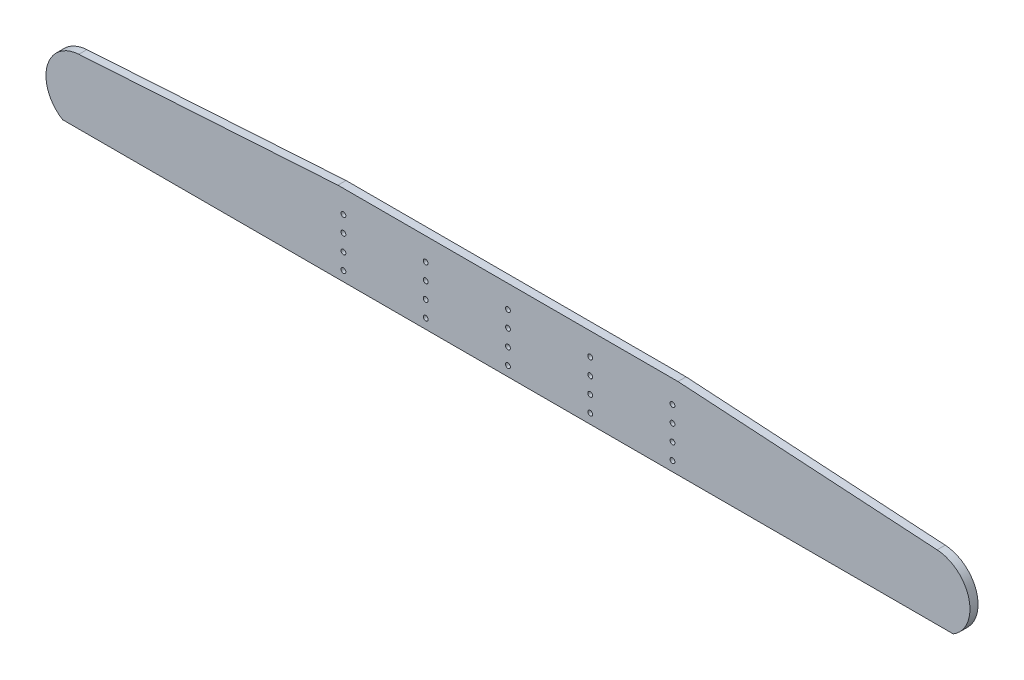
ISO-10303-21;
HEADER;
FILE_DESCRIPTION(('STEP AP214'),'2;1');
FILE_NAME('part.step','',(''),(''),'','','');
FILE_SCHEMA(('AUTOMOTIVE_DESIGN { 1 0 10303 214 1 1 1 1 }'));
ENDSEC;
DATA;
#1=APPLICATION_CONTEXT('core data for automotive mechanical design processes');
#2=APPLICATION_PROTOCOL_DEFINITION('international standard','automotive_design',2000,#1);
#3=PRODUCT_CONTEXT('',#1,'mechanical');
#4=PRODUCT('Part','Part','',(#3));
#5=PRODUCT_RELATED_PRODUCT_CATEGORY('part','',(#4));
#6=PRODUCT_DEFINITION_FORMATION('','',#4);
#7=PRODUCT_DEFINITION_CONTEXT('part definition',#1,'design');
#8=PRODUCT_DEFINITION('design','',#6,#7);
#9=PRODUCT_DEFINITION_SHAPE('','',#8);
#10=(LENGTH_UNIT() NAMED_UNIT(*) SI_UNIT(.MILLI.,.METRE.));
#11=(NAMED_UNIT(*) PLANE_ANGLE_UNIT() SI_UNIT($,.RADIAN.));
#12=(NAMED_UNIT(*) SI_UNIT($,.STERADIAN.) SOLID_ANGLE_UNIT());
#13=UNCERTAINTY_MEASURE_WITH_UNIT(LENGTH_MEASURE(1.E-05),#10,'distance_accuracy_value','');
#14=(GEOMETRIC_REPRESENTATION_CONTEXT(3) GLOBAL_UNCERTAINTY_ASSIGNED_CONTEXT((#13)) GLOBAL_UNIT_ASSIGNED_CONTEXT((#10,
#11,#12)) REPRESENTATION_CONTEXT('',''));
#15=CARTESIAN_POINT('',(0.,0.,0.));
#16=DIRECTION('',(0.,0.,1.));
#17=DIRECTION('',(1.,0.,0.));
#18=AXIS2_PLACEMENT_3D('',#15,#16,#17);
#19=CARTESIAN_POINT('',(0.,-25.,5.));
#20=DIRECTION('',(0.,-1.,0.));
#21=DIRECTION('',(0.,0.,-1.));
#22=AXIS2_PLACEMENT_3D('',#19,#20,#21);
#23=PLANE('',#22);
#24=DIRECTION('',(-1.,0.,0.));
#25=VECTOR('',#24,1.);
#26=CARTESIAN_POINT('',(0.,-25.,0.));
#27=LINE('',#26,#25);
#28=CARTESIAN_POINT('',(275.,-25.,0.));
#29=VERTEX_POINT('',#28);
#30=CARTESIAN_POINT('',(-275.,-25.,0.));
#31=VERTEX_POINT('',#30);
#32=EDGE_CURVE('E122',#29,#31,#27,.T.);
#33=ORIENTED_EDGE('',*,*,#32,.F.);
#34=DIRECTION('',(0.,0.,-1.));
#35=VECTOR('',#34,1.);
#36=CARTESIAN_POINT('',(275.,-25.,5.));
#37=LINE('',#36,#35);
#38=CARTESIAN_POINT('',(275.,-25.,5.));
#39=VERTEX_POINT('',#38);
#40=EDGE_CURVE('E12',#39,#29,#37,.T.);
#41=ORIENTED_EDGE('',*,*,#40,.F.);
#42=DIRECTION('',(-1.,0.,0.));
#43=VECTOR('',#42,1.);
#44=CARTESIAN_POINT('',(0.,-25.,5.));
#45=LINE('',#44,#43);
#46=CARTESIAN_POINT('',(-275.,-25.,5.));
#47=VERTEX_POINT('',#46);
#48=EDGE_CURVE('E136',#39,#47,#45,.T.);
#49=ORIENTED_EDGE('',*,*,#48,.T.);
#50=DIRECTION('',(0.,0.,-1.));
#51=VECTOR('',#50,1.);
#52=CARTESIAN_POINT('',(-275.,-25.,5.));
#53=LINE('',#52,#51);
#54=EDGE_CURVE('E84',#47,#31,#53,.T.);
#55=ORIENTED_EDGE('',*,*,#54,.T.);
#56=EDGE_LOOP('',(#33,#41,#49,#55));
#57=FACE_BOUND('',#56,.T.);
#58=ADVANCED_FACE('F40',(#57),#23,.T.);
#59=CARTESIAN_POINT('',(263.650793650794,-6.58730158730157,5.));
#60=DIRECTION('',(0.,0.,-1.));
#61=DIRECTION('',(-1.,0.,0.));
#62=AXIS2_PLACEMENT_3D('',#59,#60,#61);
#63=CYLINDRICAL_SURFACE('',#62,21.6294231914273);
#64=CARTESIAN_POINT('',(263.650793650794,-6.58730158730157,0.));
#65=DIRECTION('',(0.,0.,1.));
#66=DIRECTION('',(1.,0.,0.));
#67=AXIS2_PLACEMENT_3D('',#64,#65,#66);
#68=CIRCLE('',#67,21.6294231914273);
#69=CARTESIAN_POINT('',(265.,15.,0.));
#70=VERTEX_POINT('',#69);
#71=EDGE_CURVE('E125',#70,#29,#68,.F.);
#72=ORIENTED_EDGE('',*,*,#71,.F.);
#73=DIRECTION('',(0.,0.,-1.));
#74=VECTOR('',#73,1.);
#75=CARTESIAN_POINT('',(265.,15.,5.));
#76=LINE('',#75,#74);
#77=CARTESIAN_POINT('',(265.,15.,5.));
#78=VERTEX_POINT('',#77);
#79=EDGE_CURVE('E48',#78,#70,#76,.T.);
#80=ORIENTED_EDGE('',*,*,#79,.F.);
#81=CARTESIAN_POINT('',(263.650793650794,-6.58730158730157,5.));
#82=DIRECTION('',(0.,0.,1.));
#83=DIRECTION('',(1.,0.,0.));
#84=AXIS2_PLACEMENT_3D('',#81,#82,#83);
#85=CIRCLE('',#84,21.6294231914273);
#86=EDGE_CURVE('E117',#78,#39,#85,.F.);
#87=ORIENTED_EDGE('',*,*,#86,.T.);
#88=ORIENTED_EDGE('',*,*,#40,.T.);
#89=EDGE_LOOP('',(#72,#80,#87,#88));
#90=FACE_BOUND('',#89,.T.);
#91=ADVANCED_FACE('F145',(#90),#63,.T.);
#92=CARTESIAN_POINT('',(1.96498054474708,31.4396887159533,5.));
#93=DIRECTION('',(0.0623782861551805,0.998052578482888,0.));
#94=DIRECTION('',(-0.998052578482889,0.0623782861551805,0.));
#95=AXIS2_PLACEMENT_3D('',#92,#93,#94);
#96=PLANE('',#95);
#97=DIRECTION('',(0.998052578482889,-0.0623782861551805,0.));
#98=VECTOR('',#97,1.);
#99=CARTESIAN_POINT('',(1.96498054474708,31.4396887159533,0.));
#100=LINE('',#99,#98);
#101=CARTESIAN_POINT('',(105.,25.,0.));
#102=VERTEX_POINT('',#101);
#103=EDGE_CURVE('E129',#102,#70,#100,.T.);
#104=ORIENTED_EDGE('',*,*,#103,.F.);
#105=DIRECTION('',(0.,0.,-1.));
#106=VECTOR('',#105,1.);
#107=CARTESIAN_POINT('',(105.,25.,5.));
#108=LINE('',#107,#106);
#109=CARTESIAN_POINT('',(105.,25.,5.));
#110=VERTEX_POINT('',#109);
#111=EDGE_CURVE('E105',#110,#102,#108,.T.);
#112=ORIENTED_EDGE('',*,*,#111,.F.);
#113=DIRECTION('',(0.998052578482889,-0.0623782861551805,0.));
#114=VECTOR('',#113,1.);
#115=CARTESIAN_POINT('',(1.96498054474708,31.4396887159533,5.));
#116=LINE('',#115,#114);
#117=EDGE_CURVE('E115',#110,#78,#116,.T.);
#118=ORIENTED_EDGE('',*,*,#117,.T.);
#119=ORIENTED_EDGE('',*,*,#79,.T.);
#120=EDGE_LOOP('',(#104,#112,#118,#119));
#121=FACE_BOUND('',#120,.T.);
#122=ADVANCED_FACE('F142',(#121),#96,.T.);
#123=CARTESIAN_POINT('',(0.,25.,5.));
#124=DIRECTION('',(0.,1.,0.));
#125=DIRECTION('',(-1.,0.,0.));
#126=AXIS2_PLACEMENT_3D('',#123,#124,#125);
#127=PLANE('',#126);
#128=DIRECTION('',(1.,0.,0.));
#129=VECTOR('',#128,1.);
#130=CARTESIAN_POINT('',(0.,25.,0.));
#131=LINE('',#130,#129);
#132=CARTESIAN_POINT('',(-105.,25.,0.));
#133=VERTEX_POINT('',#132);
#134=EDGE_CURVE('E104',#133,#102,#131,.T.);
#135=ORIENTED_EDGE('',*,*,#134,.F.);
#136=DIRECTION('',(0.,0.,-1.));
#137=VECTOR('',#136,1.);
#138=CARTESIAN_POINT('',(-105.,25.,5.));
#139=LINE('',#138,#137);
#140=CARTESIAN_POINT('',(-105.,25.,5.));
#141=VERTEX_POINT('',#140);
#142=EDGE_CURVE('E98',#141,#133,#139,.T.);
#143=ORIENTED_EDGE('',*,*,#142,.F.);
#144=DIRECTION('',(1.,0.,0.));
#145=VECTOR('',#144,1.);
#146=CARTESIAN_POINT('',(0.,25.,5.));
#147=LINE('',#146,#145);
#148=EDGE_CURVE('E102',#141,#110,#147,.T.);
#149=ORIENTED_EDGE('',*,*,#148,.T.);
#150=ORIENTED_EDGE('',*,*,#111,.T.);
#151=EDGE_LOOP('',(#135,#143,#149,#150));
#152=FACE_BOUND('',#151,.T.);
#153=ADVANCED_FACE('F100',(#152),#127,.T.);
#154=CARTESIAN_POINT('',(-1.96498054474708,31.4396887159533,5.));
#155=DIRECTION('',(0.0623782861551805,-0.998052578482888,0.));
#156=DIRECTION('',(0.998052578482889,0.0623782861551805,0.));
#157=AXIS2_PLACEMENT_3D('',#154,#155,#156);
#158=PLANE('',#157);
#159=DIRECTION('',(-0.998052578482889,-0.0623782861551805,0.));
#160=VECTOR('',#159,1.);
#161=CARTESIAN_POINT('',(-1.96498054474708,31.4396887159533,0.));
#162=LINE('',#161,#160);
#163=CARTESIAN_POINT('',(-265.,15.,0.));
#164=VERTEX_POINT('',#163);
#165=EDGE_CURVE('E77',#133,#164,#162,.T.);
#166=ORIENTED_EDGE('',*,*,#165,.T.);
#167=DIRECTION('',(0.,0.,-1.));
#168=VECTOR('',#167,1.);
#169=CARTESIAN_POINT('',(-265.,15.,5.));
#170=LINE('',#169,#168);
#171=CARTESIAN_POINT('',(-265.,15.,5.));
#172=VERTEX_POINT('',#171);
#173=EDGE_CURVE('E106',#172,#164,#170,.T.);
#174=ORIENTED_EDGE('',*,*,#173,.F.);
#175=DIRECTION('',(-0.998052578482889,-0.0623782861551805,0.));
#176=VECTOR('',#175,1.);
#177=CARTESIAN_POINT('',(-1.96498054474708,31.4396887159533,5.));
#178=LINE('',#177,#176);
#179=EDGE_CURVE('E108',#141,#172,#178,.T.);
#180=ORIENTED_EDGE('',*,*,#179,.F.);
#181=ORIENTED_EDGE('',*,*,#142,.T.);
#182=EDGE_LOOP('',(#166,#174,#180,#181));
#183=FACE_BOUND('',#182,.T.);
#184=ADVANCED_FACE('F109',(#183),#158,.F.);
#185=CARTESIAN_POINT('',(-263.650793650794,-6.58730158730157,5.));
#186=DIRECTION('',(0.,0.,-1.));
#187=DIRECTION('',(-1.,0.,0.));
#188=AXIS2_PLACEMENT_3D('',#185,#186,#187);
#189=CYLINDRICAL_SURFACE('',#188,21.6294231914273);
#190=CARTESIAN_POINT('',(-263.650793650794,-6.58730158730157,0.));
#191=DIRECTION('',(0.,0.,1.));
#192=DIRECTION('',(1.,0.,0.));
#193=AXIS2_PLACEMENT_3D('',#190,#191,#192);
#194=CIRCLE('',#193,21.6294231914273);
#195=EDGE_CURVE('E134',#164,#31,#194,.T.);
#196=ORIENTED_EDGE('',*,*,#195,.T.);
#197=ORIENTED_EDGE('',*,*,#54,.F.);
#198=CARTESIAN_POINT('',(-263.650793650794,-6.58730158730157,5.));
#199=DIRECTION('',(0.,0.,1.));
#200=DIRECTION('',(1.,0.,0.));
#201=AXIS2_PLACEMENT_3D('',#198,#199,#200);
#202=CIRCLE('',#201,21.6294231914273);
#203=EDGE_CURVE('E56',#172,#47,#202,.T.);
#204=ORIENTED_EDGE('',*,*,#203,.F.);
#205=ORIENTED_EDGE('',*,*,#173,.T.);
#206=EDGE_LOOP('',(#196,#197,#204,#205));
#207=FACE_BOUND('',#206,.T.);
#208=ADVANCED_FACE('F150',(#207),#189,.T.);
#209=CARTESIAN_POINT('',(0.,0.,5.));
#210=DIRECTION('',(0.,0.,1.));
#211=DIRECTION('',(1.,0.,0.));
#212=AXIS2_PLACEMENT_3D('',#209,#210,#211);
#213=PLANE('',#212);
#214=CARTESIAN_POINT('',(-50.8,0.999999999999644,5.));
#215=DIRECTION('',(0.,0.,1.));
#216=DIRECTION('',(1.,0.,0.));
#217=AXIS2_PLACEMENT_3D('',#214,#215,#216);
#218=CIRCLE('',#217,1.5);
#219=CARTESIAN_POINT('',(-49.3,0.999999999999644,5.));
#220=VERTEX_POINT('',#219);
#221=EDGE_CURVE('E187',#220,#220,#218,.T.);
#222=ORIENTED_EDGE('',*,*,#221,.F.);
#223=EDGE_LOOP('',(#222));
#224=FACE_BOUND('',#223,.T.);
#225=CARTESIAN_POINT('',(-50.8,-9.00000000000036,5.));
#226=DIRECTION('',(0.,0.,1.));
#227=DIRECTION('',(1.,0.,0.));
#228=AXIS2_PLACEMENT_3D('',#225,#226,#227);
#229=CIRCLE('',#228,1.5);
#230=CARTESIAN_POINT('',(-49.3,-9.00000000000036,5.));
#231=VERTEX_POINT('',#230);
#232=EDGE_CURVE('E223',#231,#231,#229,.T.);
#233=ORIENTED_EDGE('',*,*,#232,.F.);
#234=EDGE_LOOP('',(#233));
#235=FACE_BOUND('',#234,.T.);
#236=CARTESIAN_POINT('',(-50.8,-19.0000000000004,5.));
#237=DIRECTION('',(0.,0.,1.));
#238=DIRECTION('',(1.,0.,0.));
#239=AXIS2_PLACEMENT_3D('',#236,#237,#238);
#240=CIRCLE('',#239,1.5);
#241=CARTESIAN_POINT('',(-49.3,-19.0000000000004,5.));
#242=VERTEX_POINT('',#241);
#243=EDGE_CURVE('E217',#242,#242,#240,.T.);
#244=ORIENTED_EDGE('',*,*,#243,.F.);
#245=EDGE_LOOP('',(#244));
#246=FACE_BOUND('',#245,.T.);
#247=CARTESIAN_POINT('',(50.8,-19.,5.));
#248=DIRECTION('',(0.,0.,1.));
#249=DIRECTION('',(1.,0.,0.));
#250=AXIS2_PLACEMENT_3D('',#247,#248,#249);
#251=CIRCLE('',#250,1.5);
#252=CARTESIAN_POINT('',(52.3,-19.,5.));
#253=VERTEX_POINT('',#252);
#254=EDGE_CURVE('E210',#253,#253,#251,.T.);
#255=ORIENTED_EDGE('',*,*,#254,.F.);
#256=EDGE_LOOP('',(#255));
#257=FACE_BOUND('',#256,.T.);
#258=CARTESIAN_POINT('',(50.8,-9.,5.));
#259=DIRECTION('',(0.,0.,1.));
#260=DIRECTION('',(1.,0.,0.));
#261=AXIS2_PLACEMENT_3D('',#258,#259,#260);
#262=CIRCLE('',#261,1.5);
#263=CARTESIAN_POINT('',(52.3,-9.,5.));
#264=VERTEX_POINT('',#263);
#265=EDGE_CURVE('E211',#264,#264,#262,.T.);
#266=ORIENTED_EDGE('',*,*,#265,.F.);
#267=EDGE_LOOP('',(#266));
#268=FACE_BOUND('',#267,.T.);
#269=CARTESIAN_POINT('',(50.8,0.999999999999999,5.));
#270=DIRECTION('',(0.,0.,1.));
#271=DIRECTION('',(1.,0.,0.));
#272=AXIS2_PLACEMENT_3D('',#269,#270,#271);
#273=CIRCLE('',#272,1.5);
#274=CARTESIAN_POINT('',(52.3,0.999999999999999,5.));
#275=VERTEX_POINT('',#274);
#276=EDGE_CURVE('E247',#275,#275,#273,.T.);
#277=ORIENTED_EDGE('',*,*,#276,.F.);
#278=EDGE_LOOP('',(#277));
#279=FACE_BOUND('',#278,.T.);
#280=CARTESIAN_POINT('',(50.8,11.,5.));
#281=DIRECTION('',(0.,0.,1.));
#282=DIRECTION('',(1.,0.,0.));
#283=AXIS2_PLACEMENT_3D('',#280,#281,#282);
#284=CIRCLE('',#283,1.5);
#285=CARTESIAN_POINT('',(52.3,11.,5.));
#286=VERTEX_POINT('',#285);
#287=EDGE_CURVE('E241',#286,#286,#284,.T.);
#288=ORIENTED_EDGE('',*,*,#287,.F.);
#289=EDGE_LOOP('',(#288));
#290=FACE_BOUND('',#289,.T.);
#291=CARTESIAN_POINT('',(101.6,11.,5.));
#292=DIRECTION('',(0.,0.,1.));
#293=DIRECTION('',(1.,0.,0.));
#294=AXIS2_PLACEMENT_3D('',#291,#292,#293);
#295=CIRCLE('',#294,1.5);
#296=CARTESIAN_POINT('',(103.1,11.,5.));
#297=VERTEX_POINT('',#296);
#298=EDGE_CURVE('E234',#297,#297,#295,.T.);
#299=ORIENTED_EDGE('',*,*,#298,.F.);
#300=EDGE_LOOP('',(#299));
#301=FACE_BOUND('',#300,.T.);
#302=CARTESIAN_POINT('',(0.,0.999999999999999,5.));
#303=DIRECTION('',(0.,0.,1.));
#304=DIRECTION('',(1.,0.,0.));
#305=AXIS2_PLACEMENT_3D('',#302,#303,#304);
#306=CIRCLE('',#305,1.5);
#307=CARTESIAN_POINT('',(1.5,0.999999999999999,5.));
#308=VERTEX_POINT('',#307);
#309=EDGE_CURVE('E174',#308,#308,#306,.T.);
#310=ORIENTED_EDGE('',*,*,#309,.F.);
#311=EDGE_LOOP('',(#310));
#312=FACE_BOUND('',#311,.T.);
#313=CARTESIAN_POINT('',(-101.6,-19.0000000000007,5.));
#314=DIRECTION('',(0.,0.,1.));
#315=DIRECTION('',(1.,0.,0.));
#316=AXIS2_PLACEMENT_3D('',#313,#314,#315);
#317=CIRCLE('',#316,1.5);
#318=CARTESIAN_POINT('',(-100.1,-19.0000000000007,5.));
#319=VERTEX_POINT('',#318);
#320=EDGE_CURVE('E163',#319,#319,#317,.T.);
#321=ORIENTED_EDGE('',*,*,#320,.F.);
#322=EDGE_LOOP('',(#321));
#323=FACE_BOUND('',#322,.T.);
#324=CARTESIAN_POINT('',(-101.6,-9.00000000000071,5.));
#325=DIRECTION('',(0.,0.,1.));
#326=DIRECTION('',(1.,0.,0.));
#327=AXIS2_PLACEMENT_3D('',#324,#325,#326);
#328=CIRCLE('',#327,1.5);
#329=CARTESIAN_POINT('',(-100.1,-9.00000000000071,5.));
#330=VERTEX_POINT('',#329);
#331=EDGE_CURVE('E162',#330,#330,#328,.T.);
#332=ORIENTED_EDGE('',*,*,#331,.F.);
#333=EDGE_LOOP('',(#332));
#334=FACE_BOUND('',#333,.T.);
#335=CARTESIAN_POINT('',(-101.6,0.99999999999929,5.));
#336=DIRECTION('',(0.,0.,1.));
#337=DIRECTION('',(1.,0.,0.));
#338=AXIS2_PLACEMENT_3D('',#335,#336,#337);
#339=CIRCLE('',#338,1.5);
#340=CARTESIAN_POINT('',(-100.1,0.99999999999929,5.));
#341=VERTEX_POINT('',#340);
#342=EDGE_CURVE('E156',#341,#341,#339,.T.);
#343=ORIENTED_EDGE('',*,*,#342,.F.);
#344=EDGE_LOOP('',(#343));
#345=FACE_BOUND('',#344,.T.);
#346=CARTESIAN_POINT('',(0.,-9.,5.));
#347=DIRECTION('',(0.,0.,1.));
#348=DIRECTION('',(1.,0.,0.));
#349=AXIS2_PLACEMENT_3D('',#346,#347,#348);
#350=CIRCLE('',#349,1.5);
#351=CARTESIAN_POINT('',(1.5,-9.,5.));
#352=VERTEX_POINT('',#351);
#353=EDGE_CURVE('E175',#352,#352,#350,.T.);
#354=ORIENTED_EDGE('',*,*,#353,.F.);
#355=EDGE_LOOP('',(#354));
#356=FACE_BOUND('',#355,.T.);
#357=CARTESIAN_POINT('',(0.,-19.,5.));
#358=DIRECTION('',(0.,0.,1.));
#359=DIRECTION('',(1.,0.,0.));
#360=AXIS2_PLACEMENT_3D('',#357,#358,#359);
#361=CIRCLE('',#360,1.5);
#362=CARTESIAN_POINT('',(1.5,-19.,5.));
#363=VERTEX_POINT('',#362);
#364=EDGE_CURVE('E199',#363,#363,#361,.T.);
#365=ORIENTED_EDGE('',*,*,#364,.F.);
#366=EDGE_LOOP('',(#365));
#367=FACE_BOUND('',#366,.T.);
#368=CARTESIAN_POINT('',(0.,11.,5.));
#369=DIRECTION('',(0.,0.,1.));
#370=DIRECTION('',(1.,0.,0.));
#371=AXIS2_PLACEMENT_3D('',#368,#369,#370);
#372=CIRCLE('',#371,1.5);
#373=CARTESIAN_POINT('',(1.5,11.,5.));
#374=VERTEX_POINT('',#373);
#375=EDGE_CURVE('E193',#374,#374,#372,.T.);
#376=ORIENTED_EDGE('',*,*,#375,.F.);
#377=EDGE_LOOP('',(#376));
#378=FACE_BOUND('',#377,.T.);
#379=CARTESIAN_POINT('',(-50.8,10.9999999999996,5.));
#380=DIRECTION('',(0.,0.,1.));
#381=DIRECTION('',(1.,0.,0.));
#382=AXIS2_PLACEMENT_3D('',#379,#380,#381);
#383=CIRCLE('',#382,1.5);
#384=CARTESIAN_POINT('',(-49.3,10.9999999999996,5.));
#385=VERTEX_POINT('',#384);
#386=EDGE_CURVE('E186',#385,#385,#383,.T.);
#387=ORIENTED_EDGE('',*,*,#386,.F.);
#388=EDGE_LOOP('',(#387));
#389=FACE_BOUND('',#388,.T.);
#390=CARTESIAN_POINT('',(101.6,0.999999999999999,5.));
#391=DIRECTION('',(0.,0.,1.));
#392=DIRECTION('',(1.,0.,0.));
#393=AXIS2_PLACEMENT_3D('',#390,#391,#392);
#394=CIRCLE('',#393,1.5);
#395=CARTESIAN_POINT('',(103.1,0.999999999999999,5.));
#396=VERTEX_POINT('',#395);
#397=EDGE_CURVE('E235',#396,#396,#394,.T.);
#398=ORIENTED_EDGE('',*,*,#397,.F.);
#399=EDGE_LOOP('',(#398));
#400=FACE_BOUND('',#399,.T.);
#401=CARTESIAN_POINT('',(101.6,-9.,5.));
#402=DIRECTION('',(0.,0.,1.));
#403=DIRECTION('',(1.,0.,0.));
#404=AXIS2_PLACEMENT_3D('',#401,#402,#403);
#405=CIRCLE('',#404,1.5);
#406=CARTESIAN_POINT('',(103.1,-9.,5.));
#407=VERTEX_POINT('',#406);
#408=EDGE_CURVE('E264',#407,#407,#405,.T.);
#409=ORIENTED_EDGE('',*,*,#408,.F.);
#410=EDGE_LOOP('',(#409));
#411=FACE_BOUND('',#410,.T.);
#412=CARTESIAN_POINT('',(101.6,-19.,5.));
#413=DIRECTION('',(0.,0.,1.));
#414=DIRECTION('',(1.,0.,0.));
#415=AXIS2_PLACEMENT_3D('',#412,#413,#414);
#416=CIRCLE('',#415,1.5);
#417=CARTESIAN_POINT('',(103.1,-19.,5.));
#418=VERTEX_POINT('',#417);
#419=EDGE_CURVE('E258',#418,#418,#416,.T.);
#420=ORIENTED_EDGE('',*,*,#419,.F.);
#421=EDGE_LOOP('',(#420));
#422=FACE_BOUND('',#421,.T.);
#423=CARTESIAN_POINT('',(-101.6,10.9999999999993,5.));
#424=DIRECTION('',(0.,0.,1.));
#425=DIRECTION('',(1.,0.,0.));
#426=AXIS2_PLACEMENT_3D('',#423,#424,#425);
#427=CIRCLE('',#426,1.5);
#428=CARTESIAN_POINT('',(-100.1,10.9999999999993,5.));
#429=VERTEX_POINT('',#428);
#430=EDGE_CURVE('E153',#429,#429,#427,.T.);
#431=ORIENTED_EDGE('',*,*,#430,.F.);
#432=EDGE_LOOP('',(#431));
#433=FACE_BOUND('',#432,.T.);
#434=ORIENTED_EDGE('',*,*,#48,.F.);
#435=ORIENTED_EDGE('',*,*,#86,.F.);
#436=ORIENTED_EDGE('',*,*,#117,.F.);
#437=ORIENTED_EDGE('',*,*,#148,.F.);
#438=ORIENTED_EDGE('',*,*,#179,.T.);
#439=ORIENTED_EDGE('',*,*,#203,.T.);
#440=EDGE_LOOP('',(#434,#435,#436,#437,#438,#439));
#441=FACE_BOUND('',#440,.T.);
#442=ADVANCED_FACE('F112',(#224,#235,#246,#257,#268,#279,#290,#301,#312,#323,#334,#345,#356,
#367,#378,#389,#400,#411,#422,#433,#441),#213,.T.);
#443=CARTESIAN_POINT('',(0.,0.,0.));
#444=DIRECTION('',(0.,0.,1.));
#445=DIRECTION('',(1.,0.,0.));
#446=AXIS2_PLACEMENT_3D('',#443,#444,#445);
#447=PLANE('',#446);
#448=CARTESIAN_POINT('',(-50.8,0.999999999999644,0.));
#449=DIRECTION('',(0.,0.,1.));
#450=DIRECTION('',(1.,0.,0.));
#451=AXIS2_PLACEMENT_3D('',#448,#449,#450);
#452=CIRCLE('',#451,1.5);
#453=CARTESIAN_POINT('',(-49.3,0.999999999999644,0.));
#454=VERTEX_POINT('',#453);
#455=EDGE_CURVE('E226',#454,#454,#452,.T.);
#456=ORIENTED_EDGE('',*,*,#455,.T.);
#457=EDGE_LOOP('',(#456));
#458=FACE_BOUND('',#457,.T.);
#459=CARTESIAN_POINT('',(-50.8,-9.00000000000036,0.));
#460=DIRECTION('',(0.,0.,1.));
#461=DIRECTION('',(1.,0.,0.));
#462=AXIS2_PLACEMENT_3D('',#459,#460,#461);
#463=CIRCLE('',#462,1.5);
#464=CARTESIAN_POINT('',(-49.3,-9.00000000000036,0.));
#465=VERTEX_POINT('',#464);
#466=EDGE_CURVE('E220',#465,#465,#463,.T.);
#467=ORIENTED_EDGE('',*,*,#466,.T.);
#468=EDGE_LOOP('',(#467));
#469=FACE_BOUND('',#468,.T.);
#470=CARTESIAN_POINT('',(-50.8,-19.0000000000004,0.));
#471=DIRECTION('',(0.,0.,1.));
#472=DIRECTION('',(1.,0.,0.));
#473=AXIS2_PLACEMENT_3D('',#470,#471,#472);
#474=CIRCLE('',#473,1.5);
#475=CARTESIAN_POINT('',(-49.3,-19.0000000000004,0.));
#476=VERTEX_POINT('',#475);
#477=EDGE_CURVE('E214',#476,#476,#474,.T.);
#478=ORIENTED_EDGE('',*,*,#477,.T.);
#479=EDGE_LOOP('',(#478));
#480=FACE_BOUND('',#479,.T.);
#481=CARTESIAN_POINT('',(50.8,-19.,0.));
#482=DIRECTION('',(0.,0.,1.));
#483=DIRECTION('',(1.,0.,0.));
#484=AXIS2_PLACEMENT_3D('',#481,#482,#483);
#485=CIRCLE('',#484,1.5);
#486=CARTESIAN_POINT('',(52.3,-19.,0.));
#487=VERTEX_POINT('',#486);
#488=EDGE_CURVE('E207',#487,#487,#485,.T.);
#489=ORIENTED_EDGE('',*,*,#488,.T.);
#490=EDGE_LOOP('',(#489));
#491=FACE_BOUND('',#490,.T.);
#492=CARTESIAN_POINT('',(50.8,-9.,0.));
#493=DIRECTION('',(0.,0.,1.));
#494=DIRECTION('',(1.,0.,0.));
#495=AXIS2_PLACEMENT_3D('',#492,#493,#494);
#496=CIRCLE('',#495,1.5);
#497=CARTESIAN_POINT('',(52.3,-9.,0.));
#498=VERTEX_POINT('',#497);
#499=EDGE_CURVE('E250',#498,#498,#496,.T.);
#500=ORIENTED_EDGE('',*,*,#499,.T.);
#501=EDGE_LOOP('',(#500));
#502=FACE_BOUND('',#501,.T.);
#503=CARTESIAN_POINT('',(50.8,0.999999999999999,0.));
#504=DIRECTION('',(0.,0.,1.));
#505=DIRECTION('',(1.,0.,0.));
#506=AXIS2_PLACEMENT_3D('',#503,#504,#505);
#507=CIRCLE('',#506,1.5);
#508=CARTESIAN_POINT('',(52.3,0.999999999999999,0.));
#509=VERTEX_POINT('',#508);
#510=EDGE_CURVE('E244',#509,#509,#507,.T.);
#511=ORIENTED_EDGE('',*,*,#510,.T.);
#512=EDGE_LOOP('',(#511));
#513=FACE_BOUND('',#512,.T.);
#514=CARTESIAN_POINT('',(50.8,11.,0.));
#515=DIRECTION('',(0.,0.,1.));
#516=DIRECTION('',(1.,0.,0.));
#517=AXIS2_PLACEMENT_3D('',#514,#515,#516);
#518=CIRCLE('',#517,1.5);
#519=CARTESIAN_POINT('',(52.3,11.,0.));
#520=VERTEX_POINT('',#519);
#521=EDGE_CURVE('E238',#520,#520,#518,.T.);
#522=ORIENTED_EDGE('',*,*,#521,.T.);
#523=EDGE_LOOP('',(#522));
#524=FACE_BOUND('',#523,.T.);
#525=CARTESIAN_POINT('',(101.6,11.,0.));
#526=DIRECTION('',(0.,0.,1.));
#527=DIRECTION('',(1.,0.,0.));
#528=AXIS2_PLACEMENT_3D('',#525,#526,#527);
#529=CIRCLE('',#528,1.5);
#530=CARTESIAN_POINT('',(103.1,11.,0.));
#531=VERTEX_POINT('',#530);
#532=EDGE_CURVE('E231',#531,#531,#529,.T.);
#533=ORIENTED_EDGE('',*,*,#532,.T.);
#534=EDGE_LOOP('',(#533));
#535=FACE_BOUND('',#534,.T.);
#536=CARTESIAN_POINT('',(0.,0.999999999999999,0.));
#537=DIRECTION('',(0.,0.,1.));
#538=DIRECTION('',(1.,0.,0.));
#539=AXIS2_PLACEMENT_3D('',#536,#537,#538);
#540=CIRCLE('',#539,1.5);
#541=CARTESIAN_POINT('',(1.5,0.999999999999999,0.));
#542=VERTEX_POINT('',#541);
#543=EDGE_CURVE('E171',#542,#542,#540,.T.);
#544=ORIENTED_EDGE('',*,*,#543,.T.);
#545=EDGE_LOOP('',(#544));
#546=FACE_BOUND('',#545,.T.);
#547=CARTESIAN_POINT('',(-101.6,-19.0000000000007,0.));
#548=DIRECTION('',(0.,0.,1.));
#549=DIRECTION('',(1.,0.,0.));
#550=AXIS2_PLACEMENT_3D('',#547,#548,#549);
#551=CIRCLE('',#550,1.5);
#552=CARTESIAN_POINT('',(-100.1,-19.0000000000007,0.));
#553=VERTEX_POINT('',#552);
#554=EDGE_CURVE('E178',#553,#553,#551,.T.);
#555=ORIENTED_EDGE('',*,*,#554,.T.);
#556=EDGE_LOOP('',(#555));
#557=FACE_BOUND('',#556,.T.);
#558=CARTESIAN_POINT('',(-101.6,-9.00000000000071,0.));
#559=DIRECTION('',(0.,0.,1.));
#560=DIRECTION('',(1.,0.,0.));
#561=AXIS2_PLACEMENT_3D('',#558,#559,#560);
#562=CIRCLE('',#561,1.5);
#563=CARTESIAN_POINT('',(-100.1,-9.00000000000071,0.));
#564=VERTEX_POINT('',#563);
#565=EDGE_CURVE('E159',#564,#564,#562,.T.);
#566=ORIENTED_EDGE('',*,*,#565,.T.);
#567=EDGE_LOOP('',(#566));
#568=FACE_BOUND('',#567,.T.);
#569=CARTESIAN_POINT('',(-101.6,0.99999999999929,0.));
#570=DIRECTION('',(0.,0.,1.));
#571=DIRECTION('',(1.,0.,0.));
#572=AXIS2_PLACEMENT_3D('',#569,#570,#571);
#573=CIRCLE('',#572,1.5);
#574=CARTESIAN_POINT('',(-100.1,0.99999999999929,0.));
#575=VERTEX_POINT('',#574);
#576=EDGE_CURVE('E166',#575,#575,#573,.T.);
#577=ORIENTED_EDGE('',*,*,#576,.T.);
#578=EDGE_LOOP('',(#577));
#579=FACE_BOUND('',#578,.T.);
#580=CARTESIAN_POINT('',(0.,-9.,0.));
#581=DIRECTION('',(0.,0.,1.));
#582=DIRECTION('',(1.,0.,0.));
#583=AXIS2_PLACEMENT_3D('',#580,#581,#582);
#584=CIRCLE('',#583,1.5);
#585=CARTESIAN_POINT('',(1.5,-9.,0.));
#586=VERTEX_POINT('',#585);
#587=EDGE_CURVE('E202',#586,#586,#584,.T.);
#588=ORIENTED_EDGE('',*,*,#587,.T.);
#589=EDGE_LOOP('',(#588));
#590=FACE_BOUND('',#589,.T.);
#591=CARTESIAN_POINT('',(0.,-19.,0.));
#592=DIRECTION('',(0.,0.,1.));
#593=DIRECTION('',(1.,0.,0.));
#594=AXIS2_PLACEMENT_3D('',#591,#592,#593);
#595=CIRCLE('',#594,1.5);
#596=CARTESIAN_POINT('',(1.5,-19.,0.));
#597=VERTEX_POINT('',#596);
#598=EDGE_CURVE('E196',#597,#597,#595,.T.);
#599=ORIENTED_EDGE('',*,*,#598,.T.);
#600=EDGE_LOOP('',(#599));
#601=FACE_BOUND('',#600,.T.);
#602=CARTESIAN_POINT('',(0.,11.,0.));
#603=DIRECTION('',(0.,0.,1.));
#604=DIRECTION('',(1.,0.,0.));
#605=AXIS2_PLACEMENT_3D('',#602,#603,#604);
#606=CIRCLE('',#605,1.5);
#607=CARTESIAN_POINT('',(1.5,11.,0.));
#608=VERTEX_POINT('',#607);
#609=EDGE_CURVE('E190',#608,#608,#606,.T.);
#610=ORIENTED_EDGE('',*,*,#609,.T.);
#611=EDGE_LOOP('',(#610));
#612=FACE_BOUND('',#611,.T.);
#613=CARTESIAN_POINT('',(-50.8,10.9999999999996,0.));
#614=DIRECTION('',(0.,0.,1.));
#615=DIRECTION('',(1.,0.,0.));
#616=AXIS2_PLACEMENT_3D('',#613,#614,#615);
#617=CIRCLE('',#616,1.5);
#618=CARTESIAN_POINT('',(-49.3,10.9999999999996,0.));
#619=VERTEX_POINT('',#618);
#620=EDGE_CURVE('E183',#619,#619,#617,.T.);
#621=ORIENTED_EDGE('',*,*,#620,.T.);
#622=EDGE_LOOP('',(#621));
#623=FACE_BOUND('',#622,.T.);
#624=CARTESIAN_POINT('',(101.6,0.999999999999999,0.));
#625=DIRECTION('',(0.,0.,1.));
#626=DIRECTION('',(1.,0.,0.));
#627=AXIS2_PLACEMENT_3D('',#624,#625,#626);
#628=CIRCLE('',#627,1.5);
#629=CARTESIAN_POINT('',(103.1,0.999999999999999,0.));
#630=VERTEX_POINT('',#629);
#631=EDGE_CURVE('E267',#630,#630,#628,.T.);
#632=ORIENTED_EDGE('',*,*,#631,.T.);
#633=EDGE_LOOP('',(#632));
#634=FACE_BOUND('',#633,.T.);
#635=CARTESIAN_POINT('',(101.6,-9.,0.));
#636=DIRECTION('',(0.,0.,1.));
#637=DIRECTION('',(1.,0.,0.));
#638=AXIS2_PLACEMENT_3D('',#635,#636,#637);
#639=CIRCLE('',#638,1.5);
#640=CARTESIAN_POINT('',(103.1,-9.,0.));
#641=VERTEX_POINT('',#640);
#642=EDGE_CURVE('E261',#641,#641,#639,.T.);
#643=ORIENTED_EDGE('',*,*,#642,.T.);
#644=EDGE_LOOP('',(#643));
#645=FACE_BOUND('',#644,.T.);
#646=CARTESIAN_POINT('',(101.6,-19.,0.));
#647=DIRECTION('',(0.,0.,1.));
#648=DIRECTION('',(1.,0.,0.));
#649=AXIS2_PLACEMENT_3D('',#646,#647,#648);
#650=CIRCLE('',#649,1.5);
#651=CARTESIAN_POINT('',(103.1,-19.,0.));
#652=VERTEX_POINT('',#651);
#653=EDGE_CURVE('E255',#652,#652,#650,.T.);
#654=ORIENTED_EDGE('',*,*,#653,.T.);
#655=EDGE_LOOP('',(#654));
#656=FACE_BOUND('',#655,.T.);
#657=CARTESIAN_POINT('',(-101.6,10.9999999999993,0.));
#658=DIRECTION('',(0.,0.,1.));
#659=DIRECTION('',(1.,0.,0.));
#660=AXIS2_PLACEMENT_3D('',#657,#658,#659);
#661=CIRCLE('',#660,1.5);
#662=CARTESIAN_POINT('',(-100.1,10.9999999999993,0.));
#663=VERTEX_POINT('',#662);
#664=EDGE_CURVE('E126',#663,#663,#661,.T.);
#665=ORIENTED_EDGE('',*,*,#664,.T.);
#666=EDGE_LOOP('',(#665));
#667=FACE_BOUND('',#666,.T.);
#668=ORIENTED_EDGE('',*,*,#32,.T.);
#669=ORIENTED_EDGE('',*,*,#195,.F.);
#670=ORIENTED_EDGE('',*,*,#165,.F.);
#671=ORIENTED_EDGE('',*,*,#134,.T.);
#672=ORIENTED_EDGE('',*,*,#103,.T.);
#673=ORIENTED_EDGE('',*,*,#71,.T.);
#674=EDGE_LOOP('',(#668,#669,#670,#671,#672,#673));
#675=FACE_BOUND('',#674,.T.);
#676=ADVANCED_FACE('F147',(#458,#469,#480,#491,#502,#513,#524,#535,#546,#557,#568,#579,#590,
#601,#612,#623,#634,#645,#656,#667,#675),#447,.F.);
#677=CARTESIAN_POINT('',(-101.6,10.9999999999993,0.));
#678=DIRECTION('',(0.,0.,1.));
#679=DIRECTION('',(1.,0.,0.));
#680=AXIS2_PLACEMENT_3D('',#677,#678,#679);
#681=CYLINDRICAL_SURFACE('',#680,1.5);
#682=ORIENTED_EDGE('',*,*,#664,.F.);
#683=EDGE_LOOP('',(#682));
#684=FACE_BOUND('',#683,.T.);
#685=ORIENTED_EDGE('',*,*,#430,.T.);
#686=EDGE_LOOP('',(#685));
#687=FACE_BOUND('',#686,.T.);
#688=ADVANCED_FACE('F285',(#684,#687),#681,.F.);
#689=CARTESIAN_POINT('',(101.6,-19.,0.));
#690=DIRECTION('',(0.,0.,1.));
#691=DIRECTION('',(1.,0.,0.));
#692=AXIS2_PLACEMENT_3D('',#689,#690,#691);
#693=CYLINDRICAL_SURFACE('',#692,1.5);
#694=ORIENTED_EDGE('',*,*,#653,.F.);
#695=EDGE_LOOP('',(#694));
#696=FACE_BOUND('',#695,.T.);
#697=ORIENTED_EDGE('',*,*,#419,.T.);
#698=EDGE_LOOP('',(#697));
#699=FACE_BOUND('',#698,.T.);
#700=ADVANCED_FACE('F287',(#696,#699),#693,.F.);
#701=CARTESIAN_POINT('',(101.6,-9.,0.));
#702=DIRECTION('',(0.,0.,1.));
#703=DIRECTION('',(1.,0.,0.));
#704=AXIS2_PLACEMENT_3D('',#701,#702,#703);
#705=CYLINDRICAL_SURFACE('',#704,1.5);
#706=ORIENTED_EDGE('',*,*,#642,.F.);
#707=EDGE_LOOP('',(#706));
#708=FACE_BOUND('',#707,.T.);
#709=ORIENTED_EDGE('',*,*,#408,.T.);
#710=EDGE_LOOP('',(#709));
#711=FACE_BOUND('',#710,.T.);
#712=ADVANCED_FACE('F294',(#708,#711),#705,.F.);
#713=CARTESIAN_POINT('',(101.6,0.999999999999999,0.));
#714=DIRECTION('',(0.,0.,1.));
#715=DIRECTION('',(1.,0.,0.));
#716=AXIS2_PLACEMENT_3D('',#713,#714,#715);
#717=CYLINDRICAL_SURFACE('',#716,1.5);
#718=ORIENTED_EDGE('',*,*,#631,.F.);
#719=EDGE_LOOP('',(#718));
#720=FACE_BOUND('',#719,.T.);
#721=ORIENTED_EDGE('',*,*,#397,.T.);
#722=EDGE_LOOP('',(#721));
#723=FACE_BOUND('',#722,.T.);
#724=ADVANCED_FACE('F273',(#720,#723),#717,.F.);
#725=CARTESIAN_POINT('',(-50.8,10.9999999999996,0.));
#726=DIRECTION('',(0.,0.,1.));
#727=DIRECTION('',(1.,0.,0.));
#728=AXIS2_PLACEMENT_3D('',#725,#726,#727);
#729=CYLINDRICAL_SURFACE('',#728,1.5);
#730=ORIENTED_EDGE('',*,*,#620,.F.);
#731=EDGE_LOOP('',(#730));
#732=FACE_BOUND('',#731,.T.);
#733=ORIENTED_EDGE('',*,*,#386,.T.);
#734=EDGE_LOOP('',(#733));
#735=FACE_BOUND('',#734,.T.);
#736=ADVANCED_FACE('F356',(#732,#735),#729,.F.);
#737=CARTESIAN_POINT('',(0.,11.,0.));
#738=DIRECTION('',(0.,0.,1.));
#739=DIRECTION('',(1.,0.,0.));
#740=AXIS2_PLACEMENT_3D('',#737,#738,#739);
#741=CYLINDRICAL_SURFACE('',#740,1.5);
#742=ORIENTED_EDGE('',*,*,#609,.F.);
#743=EDGE_LOOP('',(#742));
#744=FACE_BOUND('',#743,.T.);
#745=ORIENTED_EDGE('',*,*,#375,.T.);
#746=EDGE_LOOP('',(#745));
#747=FACE_BOUND('',#746,.T.);
#748=ADVANCED_FACE('F366',(#744,#747),#741,.F.);
#749=CARTESIAN_POINT('',(0.,-19.,0.));
#750=DIRECTION('',(0.,0.,1.));
#751=DIRECTION('',(1.,0.,0.));
#752=AXIS2_PLACEMENT_3D('',#749,#750,#751);
#753=CYLINDRICAL_SURFACE('',#752,1.5);
#754=ORIENTED_EDGE('',*,*,#598,.F.);
#755=EDGE_LOOP('',(#754));
#756=FACE_BOUND('',#755,.T.);
#757=ORIENTED_EDGE('',*,*,#364,.T.);
#758=EDGE_LOOP('',(#757));
#759=FACE_BOUND('',#758,.T.);
#760=ADVANCED_FACE('F376',(#756,#759),#753,.F.);
#761=CARTESIAN_POINT('',(0.,-9.,0.));
#762=DIRECTION('',(0.,0.,1.));
#763=DIRECTION('',(1.,0.,0.));
#764=AXIS2_PLACEMENT_3D('',#761,#762,#763);
#765=CYLINDRICAL_SURFACE('',#764,1.5);
#766=ORIENTED_EDGE('',*,*,#587,.F.);
#767=EDGE_LOOP('',(#766));
#768=FACE_BOUND('',#767,.T.);
#769=ORIENTED_EDGE('',*,*,#353,.T.);
#770=EDGE_LOOP('',(#769));
#771=FACE_BOUND('',#770,.T.);
#772=ADVANCED_FACE('F386',(#768,#771),#765,.F.);
#773=CARTESIAN_POINT('',(-101.6,0.99999999999929,0.));
#774=DIRECTION('',(0.,0.,1.));
#775=DIRECTION('',(1.,0.,0.));
#776=AXIS2_PLACEMENT_3D('',#773,#774,#775);
#777=CYLINDRICAL_SURFACE('',#776,1.5);
#778=ORIENTED_EDGE('',*,*,#576,.F.);
#779=EDGE_LOOP('',(#778));
#780=FACE_BOUND('',#779,.T.);
#781=ORIENTED_EDGE('',*,*,#342,.T.);
#782=EDGE_LOOP('',(#781));
#783=FACE_BOUND('',#782,.T.);
#784=ADVANCED_FACE('F396',(#780,#783),#777,.F.);
#785=CARTESIAN_POINT('',(-101.6,-9.00000000000071,0.));
#786=DIRECTION('',(0.,0.,1.));
#787=DIRECTION('',(1.,0.,0.));
#788=AXIS2_PLACEMENT_3D('',#785,#786,#787);
#789=CYLINDRICAL_SURFACE('',#788,1.5);
#790=ORIENTED_EDGE('',*,*,#565,.F.);
#791=EDGE_LOOP('',(#790));
#792=FACE_BOUND('',#791,.T.);
#793=ORIENTED_EDGE('',*,*,#331,.T.);
#794=EDGE_LOOP('',(#793));
#795=FACE_BOUND('',#794,.T.);
#796=ADVANCED_FACE('F406',(#792,#795),#789,.F.);
#797=CARTESIAN_POINT('',(-101.6,-19.0000000000007,0.));
#798=DIRECTION('',(0.,0.,1.));
#799=DIRECTION('',(1.,0.,0.));
#800=AXIS2_PLACEMENT_3D('',#797,#798,#799);
#801=CYLINDRICAL_SURFACE('',#800,1.5);
#802=ORIENTED_EDGE('',*,*,#554,.F.);
#803=EDGE_LOOP('',(#802));
#804=FACE_BOUND('',#803,.T.);
#805=ORIENTED_EDGE('',*,*,#320,.T.);
#806=EDGE_LOOP('',(#805));
#807=FACE_BOUND('',#806,.T.);
#808=ADVANCED_FACE('F416',(#804,#807),#801,.F.);
#809=CARTESIAN_POINT('',(0.,0.999999999999999,0.));
#810=DIRECTION('',(0.,0.,1.));
#811=DIRECTION('',(1.,0.,0.));
#812=AXIS2_PLACEMENT_3D('',#809,#810,#811);
#813=CYLINDRICAL_SURFACE('',#812,1.5);
#814=ORIENTED_EDGE('',*,*,#543,.F.);
#815=EDGE_LOOP('',(#814));
#816=FACE_BOUND('',#815,.T.);
#817=ORIENTED_EDGE('',*,*,#309,.T.);
#818=EDGE_LOOP('',(#817));
#819=FACE_BOUND('',#818,.T.);
#820=ADVANCED_FACE('F425',(#816,#819),#813,.F.);
#821=CARTESIAN_POINT('',(101.6,11.,0.));
#822=DIRECTION('',(0.,0.,1.));
#823=DIRECTION('',(1.,0.,0.));
#824=AXIS2_PLACEMENT_3D('',#821,#822,#823);
#825=CYLINDRICAL_SURFACE('',#824,1.5);
#826=ORIENTED_EDGE('',*,*,#532,.F.);
#827=EDGE_LOOP('',(#826));
#828=FACE_BOUND('',#827,.T.);
#829=ORIENTED_EDGE('',*,*,#298,.T.);
#830=EDGE_LOOP('',(#829));
#831=FACE_BOUND('',#830,.T.);
#832=ADVANCED_FACE('F435',(#828,#831),#825,.F.);
#833=CARTESIAN_POINT('',(50.8,11.,0.));
#834=DIRECTION('',(0.,0.,1.));
#835=DIRECTION('',(1.,0.,0.));
#836=AXIS2_PLACEMENT_3D('',#833,#834,#835);
#837=CYLINDRICAL_SURFACE('',#836,1.5);
#838=ORIENTED_EDGE('',*,*,#521,.F.);
#839=EDGE_LOOP('',(#838));
#840=FACE_BOUND('',#839,.T.);
#841=ORIENTED_EDGE('',*,*,#287,.T.);
#842=EDGE_LOOP('',(#841));
#843=FACE_BOUND('',#842,.T.);
#844=ADVANCED_FACE('F445',(#840,#843),#837,.F.);
#845=CARTESIAN_POINT('',(50.8,0.999999999999999,0.));
#846=DIRECTION('',(0.,0.,1.));
#847=DIRECTION('',(1.,0.,0.));
#848=AXIS2_PLACEMENT_3D('',#845,#846,#847);
#849=CYLINDRICAL_SURFACE('',#848,1.5);
#850=ORIENTED_EDGE('',*,*,#510,.F.);
#851=EDGE_LOOP('',(#850));
#852=FACE_BOUND('',#851,.T.);
#853=ORIENTED_EDGE('',*,*,#276,.T.);
#854=EDGE_LOOP('',(#853));
#855=FACE_BOUND('',#854,.T.);
#856=ADVANCED_FACE('F455',(#852,#855),#849,.F.);
#857=CARTESIAN_POINT('',(50.8,-9.,0.));
#858=DIRECTION('',(0.,0.,1.));
#859=DIRECTION('',(1.,0.,0.));
#860=AXIS2_PLACEMENT_3D('',#857,#858,#859);
#861=CYLINDRICAL_SURFACE('',#860,1.5);
#862=ORIENTED_EDGE('',*,*,#499,.F.);
#863=EDGE_LOOP('',(#862));
#864=FACE_BOUND('',#863,.T.);
#865=ORIENTED_EDGE('',*,*,#265,.T.);
#866=EDGE_LOOP('',(#865));
#867=FACE_BOUND('',#866,.T.);
#868=ADVANCED_FACE('F465',(#864,#867),#861,.F.);
#869=CARTESIAN_POINT('',(50.8,-19.,0.));
#870=DIRECTION('',(0.,0.,1.));
#871=DIRECTION('',(1.,0.,0.));
#872=AXIS2_PLACEMENT_3D('',#869,#870,#871);
#873=CYLINDRICAL_SURFACE('',#872,1.5);
#874=ORIENTED_EDGE('',*,*,#488,.F.);
#875=EDGE_LOOP('',(#874));
#876=FACE_BOUND('',#875,.T.);
#877=ORIENTED_EDGE('',*,*,#254,.T.);
#878=EDGE_LOOP('',(#877));
#879=FACE_BOUND('',#878,.T.);
#880=ADVANCED_FACE('F475',(#876,#879),#873,.F.);
#881=CARTESIAN_POINT('',(-50.8,-19.0000000000004,0.));
#882=DIRECTION('',(0.,0.,1.));
#883=DIRECTION('',(1.,0.,0.));
#884=AXIS2_PLACEMENT_3D('',#881,#882,#883);
#885=CYLINDRICAL_SURFACE('',#884,1.5);
#886=ORIENTED_EDGE('',*,*,#477,.F.);
#887=EDGE_LOOP('',(#886));
#888=FACE_BOUND('',#887,.T.);
#889=ORIENTED_EDGE('',*,*,#243,.T.);
#890=EDGE_LOOP('',(#889));
#891=FACE_BOUND('',#890,.T.);
#892=ADVANCED_FACE('F485',(#888,#891),#885,.F.);
#893=CARTESIAN_POINT('',(-50.8,-9.00000000000036,0.));
#894=DIRECTION('',(0.,0.,1.));
#895=DIRECTION('',(1.,0.,0.));
#896=AXIS2_PLACEMENT_3D('',#893,#894,#895);
#897=CYLINDRICAL_SURFACE('',#896,1.5);
#898=ORIENTED_EDGE('',*,*,#466,.F.);
#899=EDGE_LOOP('',(#898));
#900=FACE_BOUND('',#899,.T.);
#901=ORIENTED_EDGE('',*,*,#232,.T.);
#902=EDGE_LOOP('',(#901));
#903=FACE_BOUND('',#902,.T.);
#904=ADVANCED_FACE('F495',(#900,#903),#897,.F.);
#905=CARTESIAN_POINT('',(-50.8,0.999999999999644,0.));
#906=DIRECTION('',(0.,0.,1.));
#907=DIRECTION('',(1.,0.,0.));
#908=AXIS2_PLACEMENT_3D('',#905,#906,#907);
#909=CYLINDRICAL_SURFACE('',#908,1.5);
#910=ORIENTED_EDGE('',*,*,#455,.F.);
#911=EDGE_LOOP('',(#910));
#912=FACE_BOUND('',#911,.T.);
#913=ORIENTED_EDGE('',*,*,#221,.T.);
#914=EDGE_LOOP('',(#913));
#915=FACE_BOUND('',#914,.T.);
#916=ADVANCED_FACE('F505',(#912,#915),#909,.F.);
#917=CLOSED_SHELL('',(#58,#91,#122,#153,#184,#208,#442,#676,#688,#700,#712,#724,#736,#748,#760,
#772,#784,#796,#808,#820,#832,#844,#856,#868,#880,#892,#904,#916));
#918=MANIFOLD_SOLID_BREP('B2',#917);
#919=ADVANCED_BREP_SHAPE_REPRESENTATION('',(#18,#918),#14);
#920=SHAPE_DEFINITION_REPRESENTATION(#9,#919);
ENDSEC;
END-ISO-10303-21;
